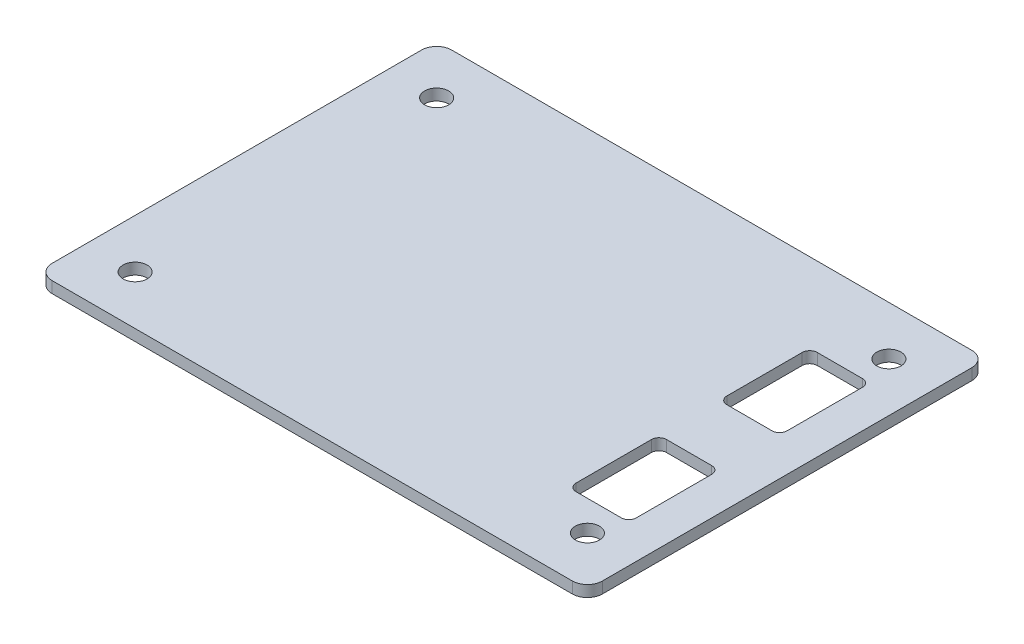
ISO-10303-21;
HEADER;
FILE_DESCRIPTION(('STEP AP214'),'2;1');
FILE_NAME('part.step','',(''),(''),'','','');
FILE_SCHEMA(('AUTOMOTIVE_DESIGN { 1 0 10303 214 1 1 1 1 }'));
ENDSEC;
DATA;
#1=APPLICATION_CONTEXT('core data for automotive mechanical design processes');
#2=APPLICATION_PROTOCOL_DEFINITION('international standard','automotive_design',2000,#1);
#3=PRODUCT_CONTEXT('',#1,'mechanical');
#4=PRODUCT('Part','Part','',(#3));
#5=PRODUCT_RELATED_PRODUCT_CATEGORY('part','',(#4));
#6=PRODUCT_DEFINITION_FORMATION('','',#4);
#7=PRODUCT_DEFINITION_CONTEXT('part definition',#1,'design');
#8=PRODUCT_DEFINITION('design','',#6,#7);
#9=PRODUCT_DEFINITION_SHAPE('','',#8);
#10=(LENGTH_UNIT() NAMED_UNIT(*) SI_UNIT(.MILLI.,.METRE.));
#11=(NAMED_UNIT(*) PLANE_ANGLE_UNIT() SI_UNIT($,.RADIAN.));
#12=(NAMED_UNIT(*) SI_UNIT($,.STERADIAN.) SOLID_ANGLE_UNIT());
#13=UNCERTAINTY_MEASURE_WITH_UNIT(LENGTH_MEASURE(1.E-05),#10,'distance_accuracy_value','');
#14=(GEOMETRIC_REPRESENTATION_CONTEXT(3) GLOBAL_UNCERTAINTY_ASSIGNED_CONTEXT((#13)) GLOBAL_UNIT_ASSIGNED_CONTEXT((#10,
#11,#12)) REPRESENTATION_CONTEXT('',''));
#15=CARTESIAN_POINT('',(0.,0.,0.));
#16=DIRECTION('',(0.,0.,1.));
#17=DIRECTION('',(1.,0.,0.));
#18=AXIS2_PLACEMENT_3D('',#15,#16,#17);
#19=CARTESIAN_POINT('',(30.,0.,20.));
#20=DIRECTION('',(0.,1.,0.));
#21=DIRECTION('',(0.,0.,1.));
#22=AXIS2_PLACEMENT_3D('',#19,#20,#21);
#23=CYLINDRICAL_SURFACE('',#22,1.6);
#24=CARTESIAN_POINT('',(30.,0.,20.));
#25=DIRECTION('',(0.,1.,0.));
#26=DIRECTION('',(0.,0.,1.));
#27=AXIS2_PLACEMENT_3D('',#24,#25,#26);
#28=CIRCLE('',#27,1.6);
#29=CARTESIAN_POINT('',(30.,0.,21.6));
#30=VERTEX_POINT('',#29);
#31=EDGE_CURVE('E272',#30,#30,#28,.T.);
#32=ORIENTED_EDGE('',*,*,#31,.F.);
#33=EDGE_LOOP('',(#32));
#34=FACE_BOUND('',#33,.T.);
#35=CARTESIAN_POINT('',(30.,1.5,20.));
#36=DIRECTION('',(0.,1.,0.));
#37=DIRECTION('',(0.,0.,1.));
#38=AXIS2_PLACEMENT_3D('',#35,#36,#37);
#39=CIRCLE('',#38,1.6);
#40=CARTESIAN_POINT('',(30.,1.5,21.6));
#41=VERTEX_POINT('',#40);
#42=EDGE_CURVE('E275',#41,#41,#39,.T.);
#43=ORIENTED_EDGE('',*,*,#42,.T.);
#44=EDGE_LOOP('',(#43));
#45=FACE_BOUND('',#44,.T.);
#46=ADVANCED_FACE('F35',(#34,#45),#23,.F.);
#47=CARTESIAN_POINT('',(-30.,0.,20.));
#48=DIRECTION('',(0.,1.,0.));
#49=DIRECTION('',(0.,0.,1.));
#50=AXIS2_PLACEMENT_3D('',#47,#48,#49);
#51=CYLINDRICAL_SURFACE('',#50,1.6);
#52=CARTESIAN_POINT('',(-30.,0.,20.));
#53=DIRECTION('',(0.,1.,0.));
#54=DIRECTION('',(0.,0.,1.));
#55=AXIS2_PLACEMENT_3D('',#52,#53,#54);
#56=CIRCLE('',#55,1.6);
#57=CARTESIAN_POINT('',(-30.,0.,21.6));
#58=VERTEX_POINT('',#57);
#59=EDGE_CURVE('E266',#58,#58,#56,.T.);
#60=ORIENTED_EDGE('',*,*,#59,.F.);
#61=EDGE_LOOP('',(#60));
#62=FACE_BOUND('',#61,.T.);
#63=CARTESIAN_POINT('',(-30.,1.5,20.));
#64=DIRECTION('',(0.,1.,0.));
#65=DIRECTION('',(0.,0.,1.));
#66=AXIS2_PLACEMENT_3D('',#63,#64,#65);
#67=CIRCLE('',#66,1.6);
#68=CARTESIAN_POINT('',(-30.,1.5,21.6));
#69=VERTEX_POINT('',#68);
#70=EDGE_CURVE('E269',#69,#69,#67,.T.);
#71=ORIENTED_EDGE('',*,*,#70,.T.);
#72=EDGE_LOOP('',(#71));
#73=FACE_BOUND('',#72,.T.);
#74=ADVANCED_FACE('F455',(#62,#73),#51,.F.);
#75=CARTESIAN_POINT('',(-36.5,1.5,26.5));
#76=DIRECTION('',(1.,0.,0.));
#77=DIRECTION('',(0.,0.,-1.));
#78=AXIS2_PLACEMENT_3D('',#75,#76,#77);
#79=PLANE('',#78);
#80=DIRECTION('',(0.,0.,1.));
#81=VECTOR('',#80,1.);
#82=CARTESIAN_POINT('',(-36.5,1.5,26.5));
#83=LINE('',#82,#81);
#84=CARTESIAN_POINT('',(-36.5,1.5,-24.5));
#85=VERTEX_POINT('',#84);
#86=CARTESIAN_POINT('',(-36.5,1.5,24.5));
#87=VERTEX_POINT('',#86);
#88=EDGE_CURVE('E216',#85,#87,#83,.T.);
#89=ORIENTED_EDGE('',*,*,#88,.F.);
#90=DIRECTION('',(0.,-1.,0.));
#91=VECTOR('',#90,1.);
#92=CARTESIAN_POINT('',(-36.5,1.5,-24.5));
#93=LINE('',#92,#91);
#94=CARTESIAN_POINT('',(-36.5,0.,-24.5));
#95=VERTEX_POINT('',#94);
#96=EDGE_CURVE('E200',#85,#95,#93,.T.);
#97=ORIENTED_EDGE('',*,*,#96,.T.);
#98=DIRECTION('',(0.,0.,1.));
#99=VECTOR('',#98,1.);
#100=CARTESIAN_POINT('',(-36.5,0.,26.5));
#101=LINE('',#100,#99);
#102=CARTESIAN_POINT('',(-36.5,0.,24.5));
#103=VERTEX_POINT('',#102);
#104=EDGE_CURVE('E213',#95,#103,#101,.T.);
#105=ORIENTED_EDGE('',*,*,#104,.T.);
#106=DIRECTION('',(0.,-1.,0.));
#107=VECTOR('',#106,1.);
#108=CARTESIAN_POINT('',(-36.5,1.5,24.5));
#109=LINE('',#108,#107);
#110=EDGE_CURVE('E218',#103,#87,#109,.F.);
#111=ORIENTED_EDGE('',*,*,#110,.T.);
#112=EDGE_LOOP('',(#89,#97,#105,#111));
#113=FACE_BOUND('',#112,.T.);
#114=ADVANCED_FACE('F212',(#113),#79,.F.);
#115=CARTESIAN_POINT('',(36.5,1.5,26.5));
#116=DIRECTION('',(0.,0.,-1.));
#117=DIRECTION('',(-1.,0.,0.));
#118=AXIS2_PLACEMENT_3D('',#115,#116,#117);
#119=PLANE('',#118);
#120=DIRECTION('',(1.,0.,0.));
#121=VECTOR('',#120,1.);
#122=CARTESIAN_POINT('',(36.5,0.,26.5));
#123=LINE('',#122,#121);
#124=CARTESIAN_POINT('',(-34.5,0.,26.5));
#125=VERTEX_POINT('',#124);
#126=CARTESIAN_POINT('',(34.5,0.,26.5));
#127=VERTEX_POINT('',#126);
#128=EDGE_CURVE('E223',#125,#127,#123,.T.);
#129=ORIENTED_EDGE('',*,*,#128,.T.);
#130=DIRECTION('',(0.,-1.,0.));
#131=VECTOR('',#130,1.);
#132=CARTESIAN_POINT('',(34.5,1.5,26.5));
#133=LINE('',#132,#131);
#134=CARTESIAN_POINT('',(34.5,1.5,26.5));
#135=VERTEX_POINT('',#134);
#136=EDGE_CURVE('E264',#127,#135,#133,.F.);
#137=ORIENTED_EDGE('',*,*,#136,.T.);
#138=DIRECTION('',(1.,0.,0.));
#139=VECTOR('',#138,1.);
#140=CARTESIAN_POINT('',(36.5,1.5,26.5));
#141=LINE('',#140,#139);
#142=CARTESIAN_POINT('',(-34.5,1.5,26.5));
#143=VERTEX_POINT('',#142);
#144=EDGE_CURVE('E411',#143,#135,#141,.T.);
#145=ORIENTED_EDGE('',*,*,#144,.F.);
#146=DIRECTION('',(0.,-1.,0.));
#147=VECTOR('',#146,1.);
#148=CARTESIAN_POINT('',(-34.5,1.5,26.5));
#149=LINE('',#148,#147);
#150=EDGE_CURVE('E261',#143,#125,#149,.T.);
#151=ORIENTED_EDGE('',*,*,#150,.T.);
#152=EDGE_LOOP('',(#129,#137,#145,#151));
#153=FACE_BOUND('',#152,.T.);
#154=ADVANCED_FACE('F436',(#153),#119,.F.);
#155=CARTESIAN_POINT('',(36.5,1.5,26.5));
#156=DIRECTION('',(-1.,0.,0.));
#157=DIRECTION('',(0.,0.,1.));
#158=AXIS2_PLACEMENT_3D('',#155,#156,#157);
#159=PLANE('',#158);
#160=DIRECTION('',(0.,0.,-1.));
#161=VECTOR('',#160,1.);
#162=CARTESIAN_POINT('',(36.5,0.,26.5));
#163=LINE('',#162,#161);
#164=CARTESIAN_POINT('',(36.5,0.,24.5));
#165=VERTEX_POINT('',#164);
#166=CARTESIAN_POINT('',(36.5,0.,-24.5));
#167=VERTEX_POINT('',#166);
#168=EDGE_CURVE('E227',#165,#167,#163,.T.);
#169=ORIENTED_EDGE('',*,*,#168,.T.);
#170=DIRECTION('',(0.,-1.,0.));
#171=VECTOR('',#170,1.);
#172=CARTESIAN_POINT('',(36.5,1.5,-24.5));
#173=LINE('',#172,#171);
#174=CARTESIAN_POINT('',(36.5,1.5,-24.5));
#175=VERTEX_POINT('',#174);
#176=EDGE_CURVE('E259',#167,#175,#173,.F.);
#177=ORIENTED_EDGE('',*,*,#176,.T.);
#178=DIRECTION('',(0.,0.,-1.));
#179=VECTOR('',#178,1.);
#180=CARTESIAN_POINT('',(36.5,1.5,26.5));
#181=LINE('',#180,#179);
#182=CARTESIAN_POINT('',(36.5,1.5,24.5));
#183=VERTEX_POINT('',#182);
#184=EDGE_CURVE('E413',#183,#175,#181,.T.);
#185=ORIENTED_EDGE('',*,*,#184,.F.);
#186=DIRECTION('',(0.,-1.,0.));
#187=VECTOR('',#186,1.);
#188=CARTESIAN_POINT('',(36.5,1.5,24.5));
#189=LINE('',#188,#187);
#190=EDGE_CURVE('E256',#183,#165,#189,.T.);
#191=ORIENTED_EDGE('',*,*,#190,.T.);
#192=EDGE_LOOP('',(#169,#177,#185,#191));
#193=FACE_BOUND('',#192,.T.);
#194=ADVANCED_FACE('F429',(#193),#159,.F.);
#195=CARTESIAN_POINT('',(36.5,1.5,-26.5));
#196=DIRECTION('',(0.,0.,1.));
#197=DIRECTION('',(1.,0.,0.));
#198=AXIS2_PLACEMENT_3D('',#195,#196,#197);
#199=PLANE('',#198);
#200=DIRECTION('',(-1.,0.,0.));
#201=VECTOR('',#200,1.);
#202=CARTESIAN_POINT('',(36.5,0.,-26.5));
#203=LINE('',#202,#201);
#204=CARTESIAN_POINT('',(34.5,0.,-26.5));
#205=VERTEX_POINT('',#204);
#206=CARTESIAN_POINT('',(-34.5,0.,-26.5));
#207=VERTEX_POINT('',#206);
#208=EDGE_CURVE('E238',#205,#207,#203,.T.);
#209=ORIENTED_EDGE('',*,*,#208,.T.);
#210=DIRECTION('',(0.,-1.,0.));
#211=VECTOR('',#210,1.);
#212=CARTESIAN_POINT('',(-34.5,1.5,-26.5));
#213=LINE('',#212,#211);
#214=CARTESIAN_POINT('',(-34.5,1.5,-26.5));
#215=VERTEX_POINT('',#214);
#216=EDGE_CURVE('E201',#207,#215,#213,.F.);
#217=ORIENTED_EDGE('',*,*,#216,.T.);
#218=DIRECTION('',(-1.,0.,0.));
#219=VECTOR('',#218,1.);
#220=CARTESIAN_POINT('',(36.5,1.5,-26.5));
#221=LINE('',#220,#219);
#222=CARTESIAN_POINT('',(34.5,1.5,-26.5));
#223=VERTEX_POINT('',#222);
#224=EDGE_CURVE('E233',#223,#215,#221,.T.);
#225=ORIENTED_EDGE('',*,*,#224,.F.);
#226=DIRECTION('',(0.,-1.,0.));
#227=VECTOR('',#226,1.);
#228=CARTESIAN_POINT('',(34.5,1.5,-26.5));
#229=LINE('',#228,#227);
#230=EDGE_CURVE('E206',#223,#205,#229,.T.);
#231=ORIENTED_EDGE('',*,*,#230,.T.);
#232=EDGE_LOOP('',(#209,#217,#225,#231));
#233=FACE_BOUND('',#232,.T.);
#234=ADVANCED_FACE('F423',(#233),#199,.F.);
#235=CARTESIAN_POINT('',(0.,1.5,0.));
#236=DIRECTION('',(0.,1.,0.));
#237=DIRECTION('',(0.,0.,1.));
#238=AXIS2_PLACEMENT_3D('',#235,#236,#237);
#239=PLANE('',#238);
#240=DIRECTION('',(0.,0.,1.));
#241=VECTOR('',#240,1.);
#242=CARTESIAN_POINT('',(23.5,1.5,4.));
#243=LINE('',#242,#241);
#244=CARTESIAN_POINT('',(23.5,1.5,5.));
#245=VERTEX_POINT('',#244);
#246=CARTESIAN_POINT('',(23.5,1.5,15.));
#247=VERTEX_POINT('',#246);
#248=EDGE_CURVE('E375',#245,#247,#243,.T.);
#249=ORIENTED_EDGE('',*,*,#248,.F.);
#250=CARTESIAN_POINT('',(24.5,1.5,5.));
#251=DIRECTION('',(0.,1.,0.));
#252=DIRECTION('',(0.,0.,1.));
#253=AXIS2_PLACEMENT_3D('',#250,#251,#252);
#254=CIRCLE('',#253,1.);
#255=CARTESIAN_POINT('',(24.5,1.5,4.));
#256=VERTEX_POINT('',#255);
#257=EDGE_CURVE('E341',#245,#256,#254,.F.);
#258=ORIENTED_EDGE('',*,*,#257,.T.);
#259=DIRECTION('',(1.,0.,0.));
#260=VECTOR('',#259,1.);
#261=CARTESIAN_POINT('',(23.5,1.5,4.));
#262=LINE('',#261,#260);
#263=CARTESIAN_POINT('',(30.5,1.5,4.));
#264=VERTEX_POINT('',#263);
#265=EDGE_CURVE('E352',#256,#264,#262,.T.);
#266=ORIENTED_EDGE('',*,*,#265,.T.);
#267=CARTESIAN_POINT('',(30.5,1.5,5.));
#268=DIRECTION('',(0.,1.,0.));
#269=DIRECTION('',(0.,0.,1.));
#270=AXIS2_PLACEMENT_3D('',#267,#268,#269);
#271=CIRCLE('',#270,1.);
#272=CARTESIAN_POINT('',(31.5,1.5,5.));
#273=VERTEX_POINT('',#272);
#274=EDGE_CURVE('E43',#264,#273,#271,.F.);
#275=ORIENTED_EDGE('',*,*,#274,.T.);
#276=DIRECTION('',(0.,0.,1.));
#277=VECTOR('',#276,1.);
#278=CARTESIAN_POINT('',(31.5,1.5,4.));
#279=LINE('',#278,#277);
#280=CARTESIAN_POINT('',(31.5,1.5,15.));
#281=VERTEX_POINT('',#280);
#282=EDGE_CURVE('E351',#273,#281,#279,.T.);
#283=ORIENTED_EDGE('',*,*,#282,.T.);
#284=CARTESIAN_POINT('',(30.5,1.5,15.));
#285=DIRECTION('',(0.,1.,0.));
#286=DIRECTION('',(0.,0.,1.));
#287=AXIS2_PLACEMENT_3D('',#284,#285,#286);
#288=CIRCLE('',#287,1.);
#289=CARTESIAN_POINT('',(30.5,1.5,16.));
#290=VERTEX_POINT('',#289);
#291=EDGE_CURVE('E333',#281,#290,#288,.F.);
#292=ORIENTED_EDGE('',*,*,#291,.T.);
#293=DIRECTION('',(1.,0.,0.));
#294=VECTOR('',#293,1.);
#295=CARTESIAN_POINT('',(23.5,1.5,16.));
#296=LINE('',#295,#294);
#297=CARTESIAN_POINT('',(24.5,1.5,16.));
#298=VERTEX_POINT('',#297);
#299=EDGE_CURVE('E360',#298,#290,#296,.T.);
#300=ORIENTED_EDGE('',*,*,#299,.F.);
#301=CARTESIAN_POINT('',(24.5,1.5,15.));
#302=DIRECTION('',(0.,1.,0.));
#303=DIRECTION('',(0.,0.,1.));
#304=AXIS2_PLACEMENT_3D('',#301,#302,#303);
#305=CIRCLE('',#304,1.);
#306=EDGE_CURVE('E337',#298,#247,#305,.F.);
#307=ORIENTED_EDGE('',*,*,#306,.T.);
#308=EDGE_LOOP('',(#249,#258,#266,#275,#283,#292,#300,#307));
#309=FACE_BOUND('',#308,.T.);
#310=DIRECTION('',(0.,0.,1.));
#311=VECTOR('',#310,1.);
#312=CARTESIAN_POINT('',(23.5,1.5,-16.));
#313=LINE('',#312,#311);
#314=CARTESIAN_POINT('',(23.5,1.5,-15.));
#315=VERTEX_POINT('',#314);
#316=CARTESIAN_POINT('',(23.5,1.5,-5.));
#317=VERTEX_POINT('',#316);
#318=EDGE_CURVE('E365',#315,#317,#313,.T.);
#319=ORIENTED_EDGE('',*,*,#318,.F.);
#320=CARTESIAN_POINT('',(24.5,1.5,-15.));
#321=DIRECTION('',(0.,1.,0.));
#322=DIRECTION('',(0.,0.,1.));
#323=AXIS2_PLACEMENT_3D('',#320,#321,#322);
#324=CIRCLE('',#323,1.);
#325=CARTESIAN_POINT('',(24.5,1.5,-16.));
#326=VERTEX_POINT('',#325);
#327=EDGE_CURVE('E306',#315,#326,#324,.F.);
#328=ORIENTED_EDGE('',*,*,#327,.T.);
#329=DIRECTION('',(1.,0.,0.));
#330=VECTOR('',#329,1.);
#331=CARTESIAN_POINT('',(23.5,1.5,-16.));
#332=LINE('',#331,#330);
#333=CARTESIAN_POINT('',(30.5,1.5,-16.));
#334=VERTEX_POINT('',#333);
#335=EDGE_CURVE('E386',#326,#334,#332,.T.);
#336=ORIENTED_EDGE('',*,*,#335,.T.);
#337=CARTESIAN_POINT('',(30.5,1.5,-15.));
#338=DIRECTION('',(0.,1.,0.));
#339=DIRECTION('',(0.,0.,1.));
#340=AXIS2_PLACEMENT_3D('',#337,#338,#339);
#341=CIRCLE('',#340,1.);
#342=CARTESIAN_POINT('',(31.5,1.5,-15.));
#343=VERTEX_POINT('',#342);
#344=EDGE_CURVE('E310',#334,#343,#341,.F.);
#345=ORIENTED_EDGE('',*,*,#344,.T.);
#346=DIRECTION('',(0.,0.,1.));
#347=VECTOR('',#346,1.);
#348=CARTESIAN_POINT('',(31.5,1.5,-16.));
#349=LINE('',#348,#347);
#350=CARTESIAN_POINT('',(31.5,1.5,-5.));
#351=VERTEX_POINT('',#350);
#352=EDGE_CURVE('E398',#343,#351,#349,.T.);
#353=ORIENTED_EDGE('',*,*,#352,.T.);
#354=CARTESIAN_POINT('',(30.5,1.5,-5.));
#355=DIRECTION('',(0.,1.,0.));
#356=DIRECTION('',(0.,0.,1.));
#357=AXIS2_PLACEMENT_3D('',#354,#355,#356);
#358=CIRCLE('',#357,1.);
#359=CARTESIAN_POINT('',(30.5,1.5,-4.));
#360=VERTEX_POINT('',#359);
#361=EDGE_CURVE('E298',#351,#360,#358,.F.);
#362=ORIENTED_EDGE('',*,*,#361,.T.);
#363=DIRECTION('',(1.,0.,0.));
#364=VECTOR('',#363,1.);
#365=CARTESIAN_POINT('',(23.5,1.5,-4.));
#366=LINE('',#365,#364);
#367=CARTESIAN_POINT('',(24.5,1.5,-4.));
#368=VERTEX_POINT('',#367);
#369=EDGE_CURVE('E369',#368,#360,#366,.T.);
#370=ORIENTED_EDGE('',*,*,#369,.F.);
#371=CARTESIAN_POINT('',(24.5,1.5,-5.));
#372=DIRECTION('',(0.,1.,0.));
#373=DIRECTION('',(0.,0.,1.));
#374=AXIS2_PLACEMENT_3D('',#371,#372,#373);
#375=CIRCLE('',#374,1.);
#376=EDGE_CURVE('E302',#368,#317,#375,.F.);
#377=ORIENTED_EDGE('',*,*,#376,.T.);
#378=EDGE_LOOP('',(#319,#328,#336,#345,#353,#362,#370,#377));
#379=FACE_BOUND('',#378,.T.);
#380=CARTESIAN_POINT('',(30.,1.5,-20.));
#381=DIRECTION('',(0.,1.,0.));
#382=DIRECTION('',(0.,0.,1.));
#383=AXIS2_PLACEMENT_3D('',#380,#381,#382);
#384=CIRCLE('',#383,1.6);
#385=CARTESIAN_POINT('',(30.,1.5,-18.4));
#386=VERTEX_POINT('',#385);
#387=EDGE_CURVE('E405',#386,#386,#384,.T.);
#388=ORIENTED_EDGE('',*,*,#387,.F.);
#389=EDGE_LOOP('',(#388));
#390=FACE_BOUND('',#389,.T.);
#391=CARTESIAN_POINT('',(-30.,1.5,-20.));
#392=DIRECTION('',(0.,1.,0.));
#393=DIRECTION('',(0.,0.,1.));
#394=AXIS2_PLACEMENT_3D('',#391,#392,#393);
#395=CIRCLE('',#394,1.6);
#396=CARTESIAN_POINT('',(-30.,1.5,-18.4));
#397=VERTEX_POINT('',#396);
#398=EDGE_CURVE('E230',#397,#397,#395,.T.);
#399=ORIENTED_EDGE('',*,*,#398,.F.);
#400=EDGE_LOOP('',(#399));
#401=FACE_BOUND('',#400,.T.);
#402=ORIENTED_EDGE('',*,*,#224,.T.);
#403=CARTESIAN_POINT('',(-34.5,1.5,-24.5));
#404=DIRECTION('',(0.,1.,0.));
#405=DIRECTION('',(0.,0.,1.));
#406=AXIS2_PLACEMENT_3D('',#403,#404,#405);
#407=CIRCLE('',#406,2.);
#408=EDGE_CURVE('E254',#215,#85,#407,.T.);
#409=ORIENTED_EDGE('',*,*,#408,.T.);
#410=ORIENTED_EDGE('',*,*,#88,.T.);
#411=CARTESIAN_POINT('',(-34.5,1.5,24.5));
#412=DIRECTION('',(0.,1.,0.));
#413=DIRECTION('',(0.,0.,1.));
#414=AXIS2_PLACEMENT_3D('',#411,#412,#413);
#415=CIRCLE('',#414,2.);
#416=EDGE_CURVE('E248',#87,#143,#415,.T.);
#417=ORIENTED_EDGE('',*,*,#416,.T.);
#418=ORIENTED_EDGE('',*,*,#144,.T.);
#419=CARTESIAN_POINT('',(34.5,1.5,24.5));
#420=DIRECTION('',(0.,1.,0.));
#421=DIRECTION('',(0.,0.,1.));
#422=AXIS2_PLACEMENT_3D('',#419,#420,#421);
#423=CIRCLE('',#422,2.);
#424=EDGE_CURVE('E250',#135,#183,#423,.T.);
#425=ORIENTED_EDGE('',*,*,#424,.T.);
#426=ORIENTED_EDGE('',*,*,#184,.T.);
#427=CARTESIAN_POINT('',(34.5,1.5,-24.5));
#428=DIRECTION('',(0.,1.,0.));
#429=DIRECTION('',(0.,0.,1.));
#430=AXIS2_PLACEMENT_3D('',#427,#428,#429);
#431=CIRCLE('',#430,2.);
#432=EDGE_CURVE('E252',#175,#223,#431,.T.);
#433=ORIENTED_EDGE('',*,*,#432,.T.);
#434=EDGE_LOOP('',(#402,#409,#410,#417,#418,#425,#426,#433));
#435=FACE_BOUND('',#434,.T.);
#436=ORIENTED_EDGE('',*,*,#70,.F.);
#437=EDGE_LOOP('',(#436));
#438=FACE_BOUND('',#437,.T.);
#439=ORIENTED_EDGE('',*,*,#42,.F.);
#440=EDGE_LOOP('',(#439));
#441=FACE_BOUND('',#440,.T.);
#442=ADVANCED_FACE('F349',(#309,#379,#390,#401,#435,#438,#441),#239,.T.);
#443=CARTESIAN_POINT('',(0.,0.,0.));
#444=DIRECTION('',(0.,1.,0.));
#445=DIRECTION('',(0.,0.,1.));
#446=AXIS2_PLACEMENT_3D('',#443,#444,#445);
#447=PLANE('',#446);
#448=DIRECTION('',(1.,0.,0.));
#449=VECTOR('',#448,1.);
#450=CARTESIAN_POINT('',(23.5,0.,4.));
#451=LINE('',#450,#449);
#452=CARTESIAN_POINT('',(24.5,0.,4.));
#453=VERTEX_POINT('',#452);
#454=CARTESIAN_POINT('',(30.5,0.,4.));
#455=VERTEX_POINT('',#454);
#456=EDGE_CURVE('E363',#453,#455,#451,.T.);
#457=ORIENTED_EDGE('',*,*,#456,.F.);
#458=CARTESIAN_POINT('',(24.5,0.,5.));
#459=DIRECTION('',(0.,1.,0.));
#460=DIRECTION('',(0.,0.,1.));
#461=AXIS2_PLACEMENT_3D('',#458,#459,#460);
#462=CIRCLE('',#461,1.);
#463=CARTESIAN_POINT('',(23.5,0.,5.));
#464=VERTEX_POINT('',#463);
#465=EDGE_CURVE('E343',#453,#464,#462,.T.);
#466=ORIENTED_EDGE('',*,*,#465,.T.);
#467=DIRECTION('',(0.,0.,1.));
#468=VECTOR('',#467,1.);
#469=CARTESIAN_POINT('',(23.5,0.,4.));
#470=LINE('',#469,#468);
#471=CARTESIAN_POINT('',(23.5,0.,15.));
#472=VERTEX_POINT('',#471);
#473=EDGE_CURVE('E381',#464,#472,#470,.T.);
#474=ORIENTED_EDGE('',*,*,#473,.T.);
#475=CARTESIAN_POINT('',(24.5,0.,15.));
#476=DIRECTION('',(0.,1.,0.));
#477=DIRECTION('',(0.,0.,1.));
#478=AXIS2_PLACEMENT_3D('',#475,#476,#477);
#479=CIRCLE('',#478,1.);
#480=CARTESIAN_POINT('',(24.5,0.,16.));
#481=VERTEX_POINT('',#480);
#482=EDGE_CURVE('E339',#472,#481,#479,.T.);
#483=ORIENTED_EDGE('',*,*,#482,.T.);
#484=DIRECTION('',(1.,0.,0.));
#485=VECTOR('',#484,1.);
#486=CARTESIAN_POINT('',(23.5,0.,16.));
#487=LINE('',#486,#485);
#488=CARTESIAN_POINT('',(30.5,0.,16.));
#489=VERTEX_POINT('',#488);
#490=EDGE_CURVE('E371',#481,#489,#487,.T.);
#491=ORIENTED_EDGE('',*,*,#490,.T.);
#492=CARTESIAN_POINT('',(30.5,0.,15.));
#493=DIRECTION('',(0.,1.,0.));
#494=DIRECTION('',(0.,0.,1.));
#495=AXIS2_PLACEMENT_3D('',#492,#493,#494);
#496=CIRCLE('',#495,1.);
#497=CARTESIAN_POINT('',(31.5,0.,15.));
#498=VERTEX_POINT('',#497);
#499=EDGE_CURVE('E335',#489,#498,#496,.T.);
#500=ORIENTED_EDGE('',*,*,#499,.T.);
#501=DIRECTION('',(0.,0.,1.));
#502=VECTOR('',#501,1.);
#503=CARTESIAN_POINT('',(31.5,0.,4.));
#504=LINE('',#503,#502);
#505=CARTESIAN_POINT('',(31.5,0.,5.));
#506=VERTEX_POINT('',#505);
#507=EDGE_CURVE('E366',#506,#498,#504,.T.);
#508=ORIENTED_EDGE('',*,*,#507,.F.);
#509=CARTESIAN_POINT('',(30.5,0.,5.));
#510=DIRECTION('',(0.,1.,0.));
#511=DIRECTION('',(0.,0.,1.));
#512=AXIS2_PLACEMENT_3D('',#509,#510,#511);
#513=CIRCLE('',#512,1.);
#514=EDGE_CURVE('E11',#506,#455,#513,.T.);
#515=ORIENTED_EDGE('',*,*,#514,.T.);
#516=EDGE_LOOP('',(#457,#466,#474,#483,#491,#500,#508,#515));
#517=FACE_BOUND('',#516,.T.);
#518=DIRECTION('',(1.,0.,0.));
#519=VECTOR('',#518,1.);
#520=CARTESIAN_POINT('',(23.5,0.,-16.));
#521=LINE('',#520,#519);
#522=CARTESIAN_POINT('',(24.5,0.,-16.));
#523=VERTEX_POINT('',#522);
#524=CARTESIAN_POINT('',(30.5,0.,-16.));
#525=VERTEX_POINT('',#524);
#526=EDGE_CURVE('E392',#523,#525,#521,.T.);
#527=ORIENTED_EDGE('',*,*,#526,.F.);
#528=CARTESIAN_POINT('',(24.5,0.,-15.));
#529=DIRECTION('',(0.,1.,0.));
#530=DIRECTION('',(0.,0.,1.));
#531=AXIS2_PLACEMENT_3D('',#528,#529,#530);
#532=CIRCLE('',#531,1.);
#533=CARTESIAN_POINT('',(23.5,0.,-15.));
#534=VERTEX_POINT('',#533);
#535=EDGE_CURVE('E308',#523,#534,#532,.T.);
#536=ORIENTED_EDGE('',*,*,#535,.T.);
#537=DIRECTION('',(0.,0.,1.));
#538=VECTOR('',#537,1.);
#539=CARTESIAN_POINT('',(23.5,0.,-16.));
#540=LINE('',#539,#538);
#541=CARTESIAN_POINT('',(23.5,0.,-5.));
#542=VERTEX_POINT('',#541);
#543=EDGE_CURVE('E382',#534,#542,#540,.T.);
#544=ORIENTED_EDGE('',*,*,#543,.T.);
#545=CARTESIAN_POINT('',(24.5,0.,-5.));
#546=DIRECTION('',(0.,1.,0.));
#547=DIRECTION('',(0.,0.,1.));
#548=AXIS2_PLACEMENT_3D('',#545,#546,#547);
#549=CIRCLE('',#548,1.);
#550=CARTESIAN_POINT('',(24.5,0.,-4.));
#551=VERTEX_POINT('',#550);
#552=EDGE_CURVE('E304',#542,#551,#549,.T.);
#553=ORIENTED_EDGE('',*,*,#552,.T.);
#554=DIRECTION('',(1.,0.,0.));
#555=VECTOR('',#554,1.);
#556=CARTESIAN_POINT('',(23.5,0.,-4.));
#557=LINE('',#556,#555);
#558=CARTESIAN_POINT('',(30.5,0.,-4.));
#559=VERTEX_POINT('',#558);
#560=EDGE_CURVE('E385',#551,#559,#557,.T.);
#561=ORIENTED_EDGE('',*,*,#560,.T.);
#562=CARTESIAN_POINT('',(30.5,0.,-5.));
#563=DIRECTION('',(0.,1.,0.));
#564=DIRECTION('',(0.,0.,1.));
#565=AXIS2_PLACEMENT_3D('',#562,#563,#564);
#566=CIRCLE('',#565,1.);
#567=CARTESIAN_POINT('',(31.5,0.,-5.));
#568=VERTEX_POINT('',#567);
#569=EDGE_CURVE('E300',#559,#568,#566,.T.);
#570=ORIENTED_EDGE('',*,*,#569,.T.);
#571=DIRECTION('',(0.,0.,1.));
#572=VECTOR('',#571,1.);
#573=CARTESIAN_POINT('',(31.5,0.,-16.));
#574=LINE('',#573,#572);
#575=CARTESIAN_POINT('',(31.5,0.,-15.));
#576=VERTEX_POINT('',#575);
#577=EDGE_CURVE('E389',#576,#568,#574,.T.);
#578=ORIENTED_EDGE('',*,*,#577,.F.);
#579=CARTESIAN_POINT('',(30.5,0.,-15.));
#580=DIRECTION('',(0.,1.,0.));
#581=DIRECTION('',(0.,0.,1.));
#582=AXIS2_PLACEMENT_3D('',#579,#580,#581);
#583=CIRCLE('',#582,1.);
#584=EDGE_CURVE('E312',#576,#525,#583,.T.);
#585=ORIENTED_EDGE('',*,*,#584,.T.);
#586=EDGE_LOOP('',(#527,#536,#544,#553,#561,#570,#578,#585));
#587=FACE_BOUND('',#586,.T.);
#588=CARTESIAN_POINT('',(30.,0.,-20.));
#589=DIRECTION('',(0.,1.,0.));
#590=DIRECTION('',(0.,0.,1.));
#591=AXIS2_PLACEMENT_3D('',#588,#589,#590);
#592=CIRCLE('',#591,1.6);
#593=CARTESIAN_POINT('',(30.,0.,-18.4));
#594=VERTEX_POINT('',#593);
#595=EDGE_CURVE('E394',#594,#594,#592,.T.);
#596=ORIENTED_EDGE('',*,*,#595,.T.);
#597=EDGE_LOOP('',(#596));
#598=FACE_BOUND('',#597,.T.);
#599=CARTESIAN_POINT('',(-30.,0.,-20.));
#600=DIRECTION('',(0.,1.,0.));
#601=DIRECTION('',(0.,0.,1.));
#602=AXIS2_PLACEMENT_3D('',#599,#600,#601);
#603=CIRCLE('',#602,1.6);
#604=CARTESIAN_POINT('',(-30.,0.,-18.4));
#605=VERTEX_POINT('',#604);
#606=EDGE_CURVE('E224',#605,#605,#603,.T.);
#607=ORIENTED_EDGE('',*,*,#606,.T.);
#608=EDGE_LOOP('',(#607));
#609=FACE_BOUND('',#608,.T.);
#610=ORIENTED_EDGE('',*,*,#104,.F.);
#611=CARTESIAN_POINT('',(-34.5,0.,-24.5));
#612=DIRECTION('',(0.,1.,0.));
#613=DIRECTION('',(0.,0.,1.));
#614=AXIS2_PLACEMENT_3D('',#611,#612,#613);
#615=CIRCLE('',#614,2.);
#616=EDGE_CURVE('E196',#95,#207,#615,.F.);
#617=ORIENTED_EDGE('',*,*,#616,.T.);
#618=ORIENTED_EDGE('',*,*,#208,.F.);
#619=CARTESIAN_POINT('',(34.5,0.,-24.5));
#620=DIRECTION('',(0.,1.,0.));
#621=DIRECTION('',(0.,0.,1.));
#622=AXIS2_PLACEMENT_3D('',#619,#620,#621);
#623=CIRCLE('',#622,2.);
#624=EDGE_CURVE('E207',#205,#167,#623,.F.);
#625=ORIENTED_EDGE('',*,*,#624,.T.);
#626=ORIENTED_EDGE('',*,*,#168,.F.);
#627=CARTESIAN_POINT('',(34.5,0.,24.5));
#628=DIRECTION('',(0.,1.,0.));
#629=DIRECTION('',(0.,0.,1.));
#630=AXIS2_PLACEMENT_3D('',#627,#628,#629);
#631=CIRCLE('',#630,2.);
#632=EDGE_CURVE('E242',#165,#127,#631,.F.);
#633=ORIENTED_EDGE('',*,*,#632,.T.);
#634=ORIENTED_EDGE('',*,*,#128,.F.);
#635=CARTESIAN_POINT('',(-34.5,0.,24.5));
#636=DIRECTION('',(0.,1.,0.));
#637=DIRECTION('',(0.,0.,1.));
#638=AXIS2_PLACEMENT_3D('',#635,#636,#637);
#639=CIRCLE('',#638,2.);
#640=EDGE_CURVE('E217',#125,#103,#639,.F.);
#641=ORIENTED_EDGE('',*,*,#640,.T.);
#642=EDGE_LOOP('',(#610,#617,#618,#625,#626,#633,#634,#641));
#643=FACE_BOUND('',#642,.T.);
#644=ORIENTED_EDGE('',*,*,#59,.T.);
#645=EDGE_LOOP('',(#644));
#646=FACE_BOUND('',#645,.T.);
#647=ORIENTED_EDGE('',*,*,#31,.T.);
#648=EDGE_LOOP('',(#647));
#649=FACE_BOUND('',#648,.T.);
#650=ADVANCED_FACE('F220',(#517,#587,#598,#609,#643,#646,#649),#447,.F.);
#651=CARTESIAN_POINT('',(-34.5,1.5,-24.5));
#652=DIRECTION('',(0.,-1.,0.));
#653=DIRECTION('',(0.,0.,-1.));
#654=AXIS2_PLACEMENT_3D('',#651,#652,#653);
#655=CYLINDRICAL_SURFACE('',#654,2.);
#656=ORIENTED_EDGE('',*,*,#408,.F.);
#657=ORIENTED_EDGE('',*,*,#216,.F.);
#658=ORIENTED_EDGE('',*,*,#616,.F.);
#659=ORIENTED_EDGE('',*,*,#96,.F.);
#660=EDGE_LOOP('',(#656,#657,#658,#659));
#661=FACE_BOUND('',#660,.T.);
#662=ADVANCED_FACE('F199',(#661),#655,.T.);
#663=CARTESIAN_POINT('',(34.5,1.5,-24.5));
#664=DIRECTION('',(0.,-1.,0.));
#665=DIRECTION('',(0.,0.,-1.));
#666=AXIS2_PLACEMENT_3D('',#663,#664,#665);
#667=CYLINDRICAL_SURFACE('',#666,2.);
#668=ORIENTED_EDGE('',*,*,#432,.F.);
#669=ORIENTED_EDGE('',*,*,#176,.F.);
#670=ORIENTED_EDGE('',*,*,#624,.F.);
#671=ORIENTED_EDGE('',*,*,#230,.F.);
#672=EDGE_LOOP('',(#668,#669,#670,#671));
#673=FACE_BOUND('',#672,.T.);
#674=ADVANCED_FACE('F425',(#673),#667,.T.);
#675=CARTESIAN_POINT('',(34.5,1.5,24.5));
#676=DIRECTION('',(0.,-1.,0.));
#677=DIRECTION('',(0.,0.,-1.));
#678=AXIS2_PLACEMENT_3D('',#675,#676,#677);
#679=CYLINDRICAL_SURFACE('',#678,2.);
#680=ORIENTED_EDGE('',*,*,#424,.F.);
#681=ORIENTED_EDGE('',*,*,#136,.F.);
#682=ORIENTED_EDGE('',*,*,#632,.F.);
#683=ORIENTED_EDGE('',*,*,#190,.F.);
#684=EDGE_LOOP('',(#680,#681,#682,#683));
#685=FACE_BOUND('',#684,.T.);
#686=ADVANCED_FACE('F433',(#685),#679,.T.);
#687=CARTESIAN_POINT('',(-34.5,1.5,24.5));
#688=DIRECTION('',(0.,-1.,0.));
#689=DIRECTION('',(0.,0.,-1.));
#690=AXIS2_PLACEMENT_3D('',#687,#688,#689);
#691=CYLINDRICAL_SURFACE('',#690,2.);
#692=ORIENTED_EDGE('',*,*,#416,.F.);
#693=ORIENTED_EDGE('',*,*,#110,.F.);
#694=ORIENTED_EDGE('',*,*,#640,.F.);
#695=ORIENTED_EDGE('',*,*,#150,.F.);
#696=EDGE_LOOP('',(#692,#693,#694,#695));
#697=FACE_BOUND('',#696,.T.);
#698=ADVANCED_FACE('F441',(#697),#691,.T.);
#699=CARTESIAN_POINT('',(-30.,0.,-20.));
#700=DIRECTION('',(0.,1.,0.));
#701=DIRECTION('',(0.,0.,1.));
#702=AXIS2_PLACEMENT_3D('',#699,#700,#701);
#703=CYLINDRICAL_SURFACE('',#702,1.6);
#704=ORIENTED_EDGE('',*,*,#606,.F.);
#705=EDGE_LOOP('',(#704));
#706=FACE_BOUND('',#705,.T.);
#707=ORIENTED_EDGE('',*,*,#398,.T.);
#708=EDGE_LOOP('',(#707));
#709=FACE_BOUND('',#708,.T.);
#710=ADVANCED_FACE('F443',(#706,#709),#703,.F.);
#711=CARTESIAN_POINT('',(30.,0.,-20.));
#712=DIRECTION('',(0.,1.,0.));
#713=DIRECTION('',(0.,0.,1.));
#714=AXIS2_PLACEMENT_3D('',#711,#712,#713);
#715=CYLINDRICAL_SURFACE('',#714,1.6);
#716=ORIENTED_EDGE('',*,*,#595,.F.);
#717=EDGE_LOOP('',(#716));
#718=FACE_BOUND('',#717,.T.);
#719=ORIENTED_EDGE('',*,*,#387,.T.);
#720=EDGE_LOOP('',(#719));
#721=FACE_BOUND('',#720,.T.);
#722=ADVANCED_FACE('F449',(#718,#721),#715,.F.);
#723=CARTESIAN_POINT('',(23.5,0.,-16.));
#724=DIRECTION('',(-1.,0.,0.));
#725=DIRECTION('',(0.,0.,1.));
#726=AXIS2_PLACEMENT_3D('',#723,#724,#725);
#727=PLANE('',#726);
#728=ORIENTED_EDGE('',*,*,#318,.T.);
#729=DIRECTION('',(0.,1.,0.));
#730=VECTOR('',#729,1.);
#731=CARTESIAN_POINT('',(23.5,0.,-5.));
#732=LINE('',#731,#730);
#733=EDGE_CURVE('E291',#317,#542,#732,.F.);
#734=ORIENTED_EDGE('',*,*,#733,.T.);
#735=ORIENTED_EDGE('',*,*,#543,.F.);
#736=DIRECTION('',(0.,1.,0.));
#737=VECTOR('',#736,1.);
#738=CARTESIAN_POINT('',(23.5,0.,-15.));
#739=LINE('',#738,#737);
#740=EDGE_CURVE('E288',#534,#315,#739,.T.);
#741=ORIENTED_EDGE('',*,*,#740,.T.);
#742=EDGE_LOOP('',(#728,#734,#735,#741));
#743=FACE_BOUND('',#742,.T.);
#744=ADVANCED_FACE('F526',(#743),#727,.F.);
#745=CARTESIAN_POINT('',(23.5,0.,-16.));
#746=DIRECTION('',(0.,0.,1.));
#747=DIRECTION('',(1.,0.,0.));
#748=AXIS2_PLACEMENT_3D('',#745,#746,#747);
#749=PLANE('',#748);
#750=ORIENTED_EDGE('',*,*,#335,.F.);
#751=DIRECTION('',(0.,1.,0.));
#752=VECTOR('',#751,1.);
#753=CARTESIAN_POINT('',(24.5,0.,-16.));
#754=LINE('',#753,#752);
#755=EDGE_CURVE('E296',#326,#523,#754,.F.);
#756=ORIENTED_EDGE('',*,*,#755,.T.);
#757=ORIENTED_EDGE('',*,*,#526,.T.);
#758=DIRECTION('',(0.,1.,0.));
#759=VECTOR('',#758,1.);
#760=CARTESIAN_POINT('',(30.5,1.5,-16.));
#761=LINE('',#760,#759);
#762=EDGE_CURVE('E293',#525,#334,#761,.T.);
#763=ORIENTED_EDGE('',*,*,#762,.T.);
#764=EDGE_LOOP('',(#750,#756,#757,#763));
#765=FACE_BOUND('',#764,.T.);
#766=ADVANCED_FACE('F522',(#765),#749,.T.);
#767=CARTESIAN_POINT('',(31.5,0.,-16.));
#768=DIRECTION('',(-1.,0.,0.));
#769=DIRECTION('',(0.,0.,1.));
#770=AXIS2_PLACEMENT_3D('',#767,#768,#769);
#771=PLANE('',#770);
#772=ORIENTED_EDGE('',*,*,#577,.T.);
#773=DIRECTION('',(0.,1.,0.));
#774=VECTOR('',#773,1.);
#775=CARTESIAN_POINT('',(31.5,0.,-5.));
#776=LINE('',#775,#774);
#777=EDGE_CURVE('E280',#568,#351,#776,.T.);
#778=ORIENTED_EDGE('',*,*,#777,.T.);
#779=ORIENTED_EDGE('',*,*,#352,.F.);
#780=DIRECTION('',(0.,1.,0.));
#781=VECTOR('',#780,1.);
#782=CARTESIAN_POINT('',(31.5,0.,-15.));
#783=LINE('',#782,#781);
#784=EDGE_CURVE('E278',#343,#576,#783,.F.);
#785=ORIENTED_EDGE('',*,*,#784,.T.);
#786=EDGE_LOOP('',(#772,#778,#779,#785));
#787=FACE_BOUND('',#786,.T.);
#788=ADVANCED_FACE('F525',(#787),#771,.T.);
#789=CARTESIAN_POINT('',(23.5,0.,-4.));
#790=DIRECTION('',(0.,0.,1.));
#791=DIRECTION('',(1.,0.,0.));
#792=AXIS2_PLACEMENT_3D('',#789,#790,#791);
#793=PLANE('',#792);
#794=ORIENTED_EDGE('',*,*,#369,.T.);
#795=DIRECTION('',(0.,1.,0.));
#796=VECTOR('',#795,1.);
#797=CARTESIAN_POINT('',(30.5,0.,-4.));
#798=LINE('',#797,#796);
#799=EDGE_CURVE('E286',#360,#559,#798,.F.);
#800=ORIENTED_EDGE('',*,*,#799,.T.);
#801=ORIENTED_EDGE('',*,*,#560,.F.);
#802=DIRECTION('',(0.,1.,0.));
#803=VECTOR('',#802,1.);
#804=CARTESIAN_POINT('',(24.5,1.5,-4.));
#805=LINE('',#804,#803);
#806=EDGE_CURVE('E283',#551,#368,#805,.T.);
#807=ORIENTED_EDGE('',*,*,#806,.T.);
#808=EDGE_LOOP('',(#794,#800,#801,#807));
#809=FACE_BOUND('',#808,.T.);
#810=ADVANCED_FACE('F469',(#809),#793,.F.);
#811=CARTESIAN_POINT('',(30.5,0.,-5.));
#812=DIRECTION('',(0.,1.,0.));
#813=DIRECTION('',(0.,0.,1.));
#814=AXIS2_PLACEMENT_3D('',#811,#812,#813);
#815=CYLINDRICAL_SURFACE('',#814,1.);
#816=ORIENTED_EDGE('',*,*,#569,.F.);
#817=ORIENTED_EDGE('',*,*,#799,.F.);
#818=ORIENTED_EDGE('',*,*,#361,.F.);
#819=ORIENTED_EDGE('',*,*,#777,.F.);
#820=EDGE_LOOP('',(#816,#817,#818,#819));
#821=FACE_BOUND('',#820,.T.);
#822=ADVANCED_FACE('F465',(#821),#815,.F.);
#823=CARTESIAN_POINT('',(24.5,0.,-5.));
#824=DIRECTION('',(0.,-1.,0.));
#825=DIRECTION('',(0.,0.,-1.));
#826=AXIS2_PLACEMENT_3D('',#823,#824,#825);
#827=CYLINDRICAL_SURFACE('',#826,1.);
#828=ORIENTED_EDGE('',*,*,#552,.F.);
#829=ORIENTED_EDGE('',*,*,#733,.F.);
#830=ORIENTED_EDGE('',*,*,#376,.F.);
#831=ORIENTED_EDGE('',*,*,#806,.F.);
#832=EDGE_LOOP('',(#828,#829,#830,#831));
#833=FACE_BOUND('',#832,.T.);
#834=ADVANCED_FACE('F468',(#833),#827,.F.);
#835=CARTESIAN_POINT('',(24.5,0.,-15.));
#836=DIRECTION('',(0.,1.,0.));
#837=DIRECTION('',(0.,0.,1.));
#838=AXIS2_PLACEMENT_3D('',#835,#836,#837);
#839=CYLINDRICAL_SURFACE('',#838,1.);
#840=ORIENTED_EDGE('',*,*,#535,.F.);
#841=ORIENTED_EDGE('',*,*,#755,.F.);
#842=ORIENTED_EDGE('',*,*,#327,.F.);
#843=ORIENTED_EDGE('',*,*,#740,.F.);
#844=EDGE_LOOP('',(#840,#841,#842,#843));
#845=FACE_BOUND('',#844,.T.);
#846=ADVANCED_FACE('F473',(#845),#839,.F.);
#847=CARTESIAN_POINT('',(30.5,0.,-15.));
#848=DIRECTION('',(0.,-1.,0.));
#849=DIRECTION('',(0.,0.,-1.));
#850=AXIS2_PLACEMENT_3D('',#847,#848,#849);
#851=CYLINDRICAL_SURFACE('',#850,1.);
#852=ORIENTED_EDGE('',*,*,#584,.F.);
#853=ORIENTED_EDGE('',*,*,#784,.F.);
#854=ORIENTED_EDGE('',*,*,#344,.F.);
#855=ORIENTED_EDGE('',*,*,#762,.F.);
#856=EDGE_LOOP('',(#852,#853,#854,#855));
#857=FACE_BOUND('',#856,.T.);
#858=ADVANCED_FACE('F477',(#857),#851,.F.);
#859=CARTESIAN_POINT('',(23.5,0.,4.));
#860=DIRECTION('',(-1.,0.,0.));
#861=DIRECTION('',(0.,0.,1.));
#862=AXIS2_PLACEMENT_3D('',#859,#860,#861);
#863=PLANE('',#862);
#864=ORIENTED_EDGE('',*,*,#248,.T.);
#865=DIRECTION('',(0.,1.,0.));
#866=VECTOR('',#865,1.);
#867=CARTESIAN_POINT('',(23.5,0.,15.));
#868=LINE('',#867,#866);
#869=EDGE_CURVE('E327',#247,#472,#868,.F.);
#870=ORIENTED_EDGE('',*,*,#869,.T.);
#871=ORIENTED_EDGE('',*,*,#473,.F.);
#872=DIRECTION('',(0.,1.,0.));
#873=VECTOR('',#872,1.);
#874=CARTESIAN_POINT('',(23.5,0.,5.));
#875=LINE('',#874,#873);
#876=EDGE_CURVE('E324',#464,#245,#875,.T.);
#877=ORIENTED_EDGE('',*,*,#876,.T.);
#878=EDGE_LOOP('',(#864,#870,#871,#877));
#879=FACE_BOUND('',#878,.T.);
#880=ADVANCED_FACE('F481',(#879),#863,.F.);
#881=CARTESIAN_POINT('',(23.5,0.,4.));
#882=DIRECTION('',(0.,0.,1.));
#883=DIRECTION('',(1.,0.,0.));
#884=AXIS2_PLACEMENT_3D('',#881,#882,#883);
#885=PLANE('',#884);
#886=ORIENTED_EDGE('',*,*,#265,.F.);
#887=DIRECTION('',(0.,1.,0.));
#888=VECTOR('',#887,1.);
#889=CARTESIAN_POINT('',(24.5,0.,4.));
#890=LINE('',#889,#888);
#891=EDGE_CURVE('E55',#256,#453,#890,.F.);
#892=ORIENTED_EDGE('',*,*,#891,.T.);
#893=ORIENTED_EDGE('',*,*,#456,.T.);
#894=DIRECTION('',(0.,1.,0.));
#895=VECTOR('',#894,1.);
#896=CARTESIAN_POINT('',(30.5,1.5,4.));
#897=LINE('',#896,#895);
#898=EDGE_CURVE('E329',#455,#264,#897,.T.);
#899=ORIENTED_EDGE('',*,*,#898,.T.);
#900=EDGE_LOOP('',(#886,#892,#893,#899));
#901=FACE_BOUND('',#900,.T.);
#902=ADVANCED_FACE('F362',(#901),#885,.T.);
#903=CARTESIAN_POINT('',(31.5,0.,4.));
#904=DIRECTION('',(-1.,0.,0.));
#905=DIRECTION('',(0.,0.,1.));
#906=AXIS2_PLACEMENT_3D('',#903,#904,#905);
#907=PLANE('',#906);
#908=ORIENTED_EDGE('',*,*,#507,.T.);
#909=DIRECTION('',(0.,1.,0.));
#910=VECTOR('',#909,1.);
#911=CARTESIAN_POINT('',(31.5,0.,15.));
#912=LINE('',#911,#910);
#913=EDGE_CURVE('E316',#498,#281,#912,.T.);
#914=ORIENTED_EDGE('',*,*,#913,.T.);
#915=ORIENTED_EDGE('',*,*,#282,.F.);
#916=DIRECTION('',(0.,1.,0.));
#917=VECTOR('',#916,1.);
#918=CARTESIAN_POINT('',(31.5,0.,5.));
#919=LINE('',#918,#917);
#920=EDGE_CURVE('E314',#273,#506,#919,.F.);
#921=ORIENTED_EDGE('',*,*,#920,.T.);
#922=EDGE_LOOP('',(#908,#914,#915,#921));
#923=FACE_BOUND('',#922,.T.);
#924=ADVANCED_FACE('F358',(#923),#907,.T.);
#925=CARTESIAN_POINT('',(23.5,0.,16.));
#926=DIRECTION('',(0.,0.,1.));
#927=DIRECTION('',(1.,0.,0.));
#928=AXIS2_PLACEMENT_3D('',#925,#926,#927);
#929=PLANE('',#928);
#930=ORIENTED_EDGE('',*,*,#299,.T.);
#931=DIRECTION('',(0.,1.,0.));
#932=VECTOR('',#931,1.);
#933=CARTESIAN_POINT('',(30.5,0.,16.));
#934=LINE('',#933,#932);
#935=EDGE_CURVE('E322',#290,#489,#934,.F.);
#936=ORIENTED_EDGE('',*,*,#935,.T.);
#937=ORIENTED_EDGE('',*,*,#490,.F.);
#938=DIRECTION('',(0.,1.,0.));
#939=VECTOR('',#938,1.);
#940=CARTESIAN_POINT('',(24.5,1.5,16.));
#941=LINE('',#940,#939);
#942=EDGE_CURVE('E319',#481,#298,#941,.T.);
#943=ORIENTED_EDGE('',*,*,#942,.T.);
#944=EDGE_LOOP('',(#930,#936,#937,#943));
#945=FACE_BOUND('',#944,.T.);
#946=ADVANCED_FACE('F487',(#945),#929,.F.);
#947=CARTESIAN_POINT('',(30.5,0.,15.));
#948=DIRECTION('',(0.,1.,0.));
#949=DIRECTION('',(0.,0.,1.));
#950=AXIS2_PLACEMENT_3D('',#947,#948,#949);
#951=CYLINDRICAL_SURFACE('',#950,1.);
#952=ORIENTED_EDGE('',*,*,#499,.F.);
#953=ORIENTED_EDGE('',*,*,#935,.F.);
#954=ORIENTED_EDGE('',*,*,#291,.F.);
#955=ORIENTED_EDGE('',*,*,#913,.F.);
#956=EDGE_LOOP('',(#952,#953,#954,#955));
#957=FACE_BOUND('',#956,.T.);
#958=ADVANCED_FACE('F483',(#957),#951,.F.);
#959=CARTESIAN_POINT('',(24.5,0.,15.));
#960=DIRECTION('',(0.,-1.,0.));
#961=DIRECTION('',(0.,0.,-1.));
#962=AXIS2_PLACEMENT_3D('',#959,#960,#961);
#963=CYLINDRICAL_SURFACE('',#962,1.);
#964=ORIENTED_EDGE('',*,*,#482,.F.);
#965=ORIENTED_EDGE('',*,*,#869,.F.);
#966=ORIENTED_EDGE('',*,*,#306,.F.);
#967=ORIENTED_EDGE('',*,*,#942,.F.);
#968=EDGE_LOOP('',(#964,#965,#966,#967));
#969=FACE_BOUND('',#968,.T.);
#970=ADVANCED_FACE('F486',(#969),#963,.F.);
#971=CARTESIAN_POINT('',(24.5,0.,5.));
#972=DIRECTION('',(0.,1.,0.));
#973=DIRECTION('',(0.,0.,1.));
#974=AXIS2_PLACEMENT_3D('',#971,#972,#973);
#975=CYLINDRICAL_SURFACE('',#974,1.);
#976=ORIENTED_EDGE('',*,*,#465,.F.);
#977=ORIENTED_EDGE('',*,*,#891,.F.);
#978=ORIENTED_EDGE('',*,*,#257,.F.);
#979=ORIENTED_EDGE('',*,*,#876,.F.);
#980=EDGE_LOOP('',(#976,#977,#978,#979));
#981=FACE_BOUND('',#980,.T.);
#982=ADVANCED_FACE('F490',(#981),#975,.F.);
#983=CARTESIAN_POINT('',(30.5,0.,5.));
#984=DIRECTION('',(0.,-1.,0.));
#985=DIRECTION('',(0.,0.,-1.));
#986=AXIS2_PLACEMENT_3D('',#983,#984,#985);
#987=CYLINDRICAL_SURFACE('',#986,1.);
#988=ORIENTED_EDGE('',*,*,#514,.F.);
#989=ORIENTED_EDGE('',*,*,#920,.F.);
#990=ORIENTED_EDGE('',*,*,#274,.F.);
#991=ORIENTED_EDGE('',*,*,#898,.F.);
#992=EDGE_LOOP('',(#988,#989,#990,#991));
#993=FACE_BOUND('',#992,.T.);
#994=ADVANCED_FACE('F37',(#993),#987,.F.);
#995=CLOSED_SHELL('',(#46,#74,#114,#154,#194,#234,#442,#650,#662,#674,#686,#698,#710,#722,#744,
#766,#788,#810,#822,#834,#846,#858,#880,#902,#924,#946,#958,#970,#982,#994));
#996=MANIFOLD_SOLID_BREP('B2',#995);
#997=ADVANCED_BREP_SHAPE_REPRESENTATION('',(#18,#996),#14);
#998=SHAPE_DEFINITION_REPRESENTATION(#9,#997);
ENDSEC;
END-ISO-10303-21;
